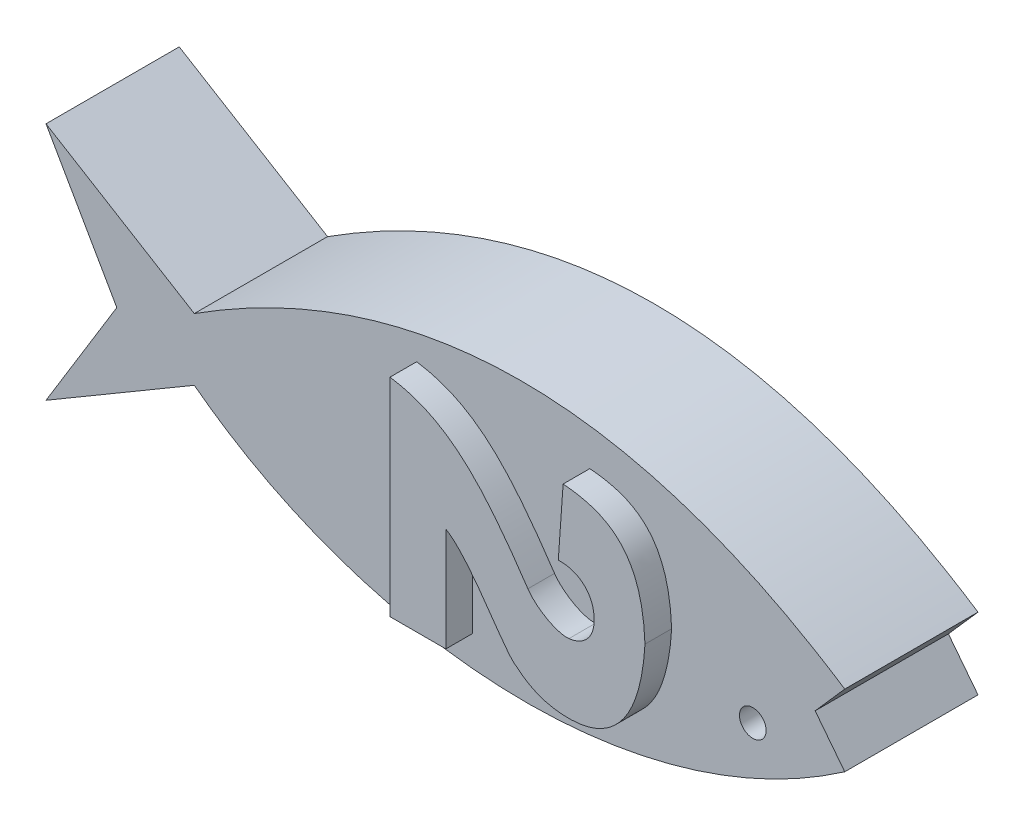
ISO-10303-21;
HEADER;
FILE_DESCRIPTION(('STEP AP214'),'2;1');
FILE_NAME('part.step','',(''),(''),'','','');
FILE_SCHEMA(('AUTOMOTIVE_DESIGN { 1 0 10303 214 1 1 1 1 }'));
ENDSEC;
DATA;
#1=APPLICATION_CONTEXT('core data for automotive mechanical design processes');
#2=APPLICATION_PROTOCOL_DEFINITION('international standard','automotive_design',2000,#1);
#3=PRODUCT_CONTEXT('',#1,'mechanical');
#4=PRODUCT('Part','Part','',(#3));
#5=PRODUCT_RELATED_PRODUCT_CATEGORY('part','',(#4));
#6=PRODUCT_DEFINITION_FORMATION('','',#4);
#7=PRODUCT_DEFINITION_CONTEXT('part definition',#1,'design');
#8=PRODUCT_DEFINITION('design','',#6,#7);
#9=PRODUCT_DEFINITION_SHAPE('','',#8);
#10=(LENGTH_UNIT() NAMED_UNIT(*) SI_UNIT(.MILLI.,.METRE.));
#11=(NAMED_UNIT(*) PLANE_ANGLE_UNIT() SI_UNIT($,.RADIAN.));
#12=(NAMED_UNIT(*) SI_UNIT($,.STERADIAN.) SOLID_ANGLE_UNIT());
#13=UNCERTAINTY_MEASURE_WITH_UNIT(LENGTH_MEASURE(1.E-05),#10,'distance_accuracy_value','');
#14=(GEOMETRIC_REPRESENTATION_CONTEXT(3) GLOBAL_UNCERTAINTY_ASSIGNED_CONTEXT((#13)) GLOBAL_UNIT_ASSIGNED_CONTEXT((#10,
#11,#12)) REPRESENTATION_CONTEXT('',''));
#15=CARTESIAN_POINT('',(0.,0.,0.));
#16=DIRECTION('',(0.,0.,1.));
#17=DIRECTION('',(1.,0.,0.));
#18=AXIS2_PLACEMENT_3D('',#15,#16,#17);
#19=CARTESIAN_POINT('',(17.259438939303,-10.3520637776499,5.));
#20=DIRECTION('',(0.,0.,-1.));
#21=DIRECTION('',(-1.,0.,0.));
#22=AXIS2_PLACEMENT_3D('',#19,#20,#21);
#23=PLANE('',#22);
#24=CARTESIAN_POINT('',(29.9729583496422,-6.64273710384665,5.));
#25=CARTESIAN_POINT('',(22.1417553800262,-12.0787378702692,5.));
#26=CARTESIAN_POINT('',(12.037313537676,-11.2172776076084,5.));
#27=CARTESIAN_POINT('',(5.56534641167516,-6.28572668371996,5.));
#28=B_SPLINE_CURVE_WITH_KNOTS('',3,(#24,#25,#26,#27),.UNSPECIFIED.,.F.,.F.,(4,4),(0.,1.),.UNSPECIFIED.);
#29=CARTESIAN_POINT('',(29.9729583496422,-6.64273710384666,5.));
#30=VERTEX_POINT('',#29);
#31=CARTESIAN_POINT('',(5.56534641167516,-6.28572668371996,5.));
#32=VERTEX_POINT('',#31);
#33=EDGE_CURVE('E204',#30,#32,#28,.T.);
#34=ORIENTED_EDGE('',*,*,#33,.F.);
#35=DIRECTION('',(0.614154388439045,-0.789185901521982,0.));
#36=VECTOR('',#35,1.);
#37=CARTESIAN_POINT('',(29.9729583496422,-6.64273710384666,5.));
#38=LINE('',#37,#36);
#39=CARTESIAN_POINT('',(28.8624377925117,-5.21572268607917,5.));
#40=VERTEX_POINT('',#39);
#41=EDGE_CURVE('E309',#40,#30,#38,.T.);
#42=ORIENTED_EDGE('',*,*,#41,.F.);
#43=DIRECTION('',(-0.660642607187039,-0.750700569847333,0.));
#44=VECTOR('',#43,1.);
#45=CARTESIAN_POINT('',(28.8624377925117,-5.21572268607917,5.));
#46=LINE('',#45,#44);
#47=CARTESIAN_POINT('',(29.9729583496422,-3.95381737449974,5.));
#48=VERTEX_POINT('',#47);
#49=EDGE_CURVE('E232',#48,#40,#46,.T.);
#50=ORIENTED_EDGE('',*,*,#49,.F.);
#51=CARTESIAN_POINT('',(5.56534641167516,-3.95381737449974,5.));
#52=CARTESIAN_POINT('',(17.9190768037639,3.93971731756191,5.));
#53=CARTESIAN_POINT('',(29.9729583496422,-3.95381737449974,5.));
#54=B_SPLINE_CURVE_WITH_KNOTS('',2,(#51,#52,#53),.UNSPECIFIED.,.F.,.F.,(3,3),(0.,1.),.UNSPECIFIED.);
#55=CARTESIAN_POINT('',(5.56534641167516,-3.95381737449974,5.));
#56=VERTEX_POINT('',#55);
#57=EDGE_CURVE('E226',#56,#48,#54,.T.);
#58=ORIENTED_EDGE('',*,*,#57,.F.);
#59=DIRECTION('',(0.854463584925546,-0.519511291538677,0.));
#60=VECTOR('',#59,1.);
#61=CARTESIAN_POINT('',(0.,-0.57010348288733,5.));
#62=LINE('',#61,#60);
#63=CARTESIAN_POINT('',(0.,-0.57010348288733,5.));
#64=VERTEX_POINT('',#63);
#65=EDGE_CURVE('E223',#64,#56,#62,.T.);
#66=ORIENTED_EDGE('',*,*,#65,.F.);
#67=DIRECTION('',(-0.496395302563674,0.868096598076918,0.));
#68=VECTOR('',#67,1.);
#69=CARTESIAN_POINT('',(2.65645960953265,-5.21572268607917,5.));
#70=LINE('',#69,#68);
#71=CARTESIAN_POINT('',(2.65645960953265,-5.21572268607917,5.));
#72=VERTEX_POINT('',#71);
#73=EDGE_CURVE('E220',#72,#64,#70,.T.);
#74=ORIENTED_EDGE('',*,*,#73,.F.);
#75=DIRECTION('',(0.522020846211848,0.852932726608767,0.));
#76=VECTOR('',#75,1.);
#77=CARTESIAN_POINT('',(0.,-9.55612662650962,5.));
#78=LINE('',#77,#76);
#79=CARTESIAN_POINT('',(0.,-9.55612662650962,5.));
#80=VERTEX_POINT('',#79);
#81=EDGE_CURVE('E217',#80,#72,#78,.T.);
#82=ORIENTED_EDGE('',*,*,#81,.F.);
#83=DIRECTION('',(-0.862159793400117,-0.506636448199563,0.));
#84=VECTOR('',#83,1.);
#85=CARTESIAN_POINT('',(5.56534641167516,-6.28572668371996,5.));
#86=LINE('',#85,#84);
#87=EDGE_CURVE('E210',#32,#80,#86,.T.);
#88=ORIENTED_EDGE('',*,*,#87,.F.);
#89=EDGE_LOOP('',(#34,#42,#50,#58,#66,#74,#82,#88));
#90=FACE_BOUND('',#89,.T.);
#91=CARTESIAN_POINT('',(26.5225963003921,-6.78066616591444,5.));
#92=DIRECTION('',(0.,0.,-1.));
#93=DIRECTION('',(-1.,0.,0.));
#94=AXIS2_PLACEMENT_3D('',#91,#92,#93);
#95=CIRCLE('',#94,0.500109692947174);
#96=CARTESIAN_POINT('',(26.0224866074449,-6.78066616591444,5.));
#97=VERTEX_POINT('',#96);
#98=EDGE_CURVE('E196',#97,#97,#95,.T.);
#99=ORIENTED_EDGE('',*,*,#98,.T.);
#100=EDGE_LOOP('',(#99));
#101=FACE_BOUND('',#100,.T.);
#102=CARTESIAN_POINT('',(19.0825608950754,-5.63934124906223,5.));
#103=CARTESIAN_POINT('',(17.4378767824114,-3.20471995006712,5.));
#104=CARTESIAN_POINT('',(16.1255534367257,-1.67091653548521,5.));
#105=CARTESIAN_POINT('',(13.9083053342404,-1.34956401969995,5.));
#106=B_SPLINE_CURVE_WITH_KNOTS('',3,(#102,#103,#104,#105),.UNSPECIFIED.,.F.,.F.,(4,4),(0.,1.),.UNSPECIFIED.);
#107=CARTESIAN_POINT('',(19.0825608950754,-5.63934124906223,5.));
#108=VERTEX_POINT('',#107);
#109=CARTESIAN_POINT('',(13.9083053342404,-1.34956401969995,5.));
#110=VERTEX_POINT('',#109);
#111=EDGE_CURVE('E192',#108,#110,#106,.T.);
#112=ORIENTED_EDGE('',*,*,#111,.F.);
#113=CARTESIAN_POINT('',(20.6238828439911,-6.48748857334275,5.));
#114=CARTESIAN_POINT('',(20.2101931840299,-6.5445847229111,5.));
#115=CARTESIAN_POINT('',(19.4098510301083,-6.12593459302331,5.));
#116=CARTESIAN_POINT('',(19.0825608950754,-5.63934124906223,5.));
#117=B_SPLINE_CURVE_WITH_KNOTS('',3,(#113,#114,#115,#116),.UNSPECIFIED.,.F.,.F.,(4,4),(0.,1.),.UNSPECIFIED.);
#118=CARTESIAN_POINT('',(20.6238828439911,-6.48748857334275,5.));
#119=VERTEX_POINT('',#118);
#120=EDGE_CURVE('E189',#119,#108,#117,.T.);
#121=ORIENTED_EDGE('',*,*,#120,.F.);
#122=CARTESIAN_POINT('',(21.5695602903217,-5.43144256363508,5.));
#123=CARTESIAN_POINT('',(21.5578487234398,-6.102593617884,5.));
#124=CARTESIAN_POINT('',(21.0935036805256,-6.43515902342427,5.));
#125=CARTESIAN_POINT('',(20.6238828439911,-6.48748857334275,5.));
#126=B_SPLINE_CURVE_WITH_KNOTS('',3,(#122,#123,#124,#125),.UNSPECIFIED.,.F.,.F.,(4,4),(0.,1.),.UNSPECIFIED.);
#127=CARTESIAN_POINT('',(21.5695602903217,-5.43144256363508,5.));
#128=VERTEX_POINT('',#127);
#129=EDGE_CURVE('E578',#128,#119,#126,.T.);
#130=ORIENTED_EDGE('',*,*,#129,.F.);
#131=CARTESIAN_POINT('',(20.2233194358235,-4.14083296285347,5.));
#132=CARTESIAN_POINT('',(20.8433595897719,-4.09612471432961,5.));
#133=CARTESIAN_POINT('',(21.5828447940639,-4.48485044834034,5.));
#134=CARTESIAN_POINT('',(21.5695602903217,-5.43144256363508,5.));
#135=B_SPLINE_CURVE_WITH_KNOTS('',3,(#131,#132,#133,#134),.UNSPECIFIED.,.F.,.F.,(4,4),(0.,1.),.UNSPECIFIED.);
#136=CARTESIAN_POINT('',(20.2233194358235,-4.14083296285347,5.));
#137=VERTEX_POINT('',#136);
#138=EDGE_CURVE('E573',#137,#128,#135,.T.);
#139=ORIENTED_EDGE('',*,*,#138,.F.);
#140=DIRECTION('',(-0.0704460164719734,-0.997515593243149,0.));
#141=VECTOR('',#140,1.);
#142=CARTESIAN_POINT('',(20.4044963276472,-1.57536817462962,5.));
#143=LINE('',#142,#141);
#144=CARTESIAN_POINT('',(20.4044963276472,-1.57536817462962,5.));
#145=VERTEX_POINT('',#144);
#146=EDGE_CURVE('E567',#145,#137,#143,.T.);
#147=ORIENTED_EDGE('',*,*,#146,.F.);
#148=CARTESIAN_POINT('',(23.4764886938752,-5.24176877257535,5.));
#149=CARTESIAN_POINT('',(23.3817110794889,-2.66912801857253,5.));
#150=CARTESIAN_POINT('',(22.3343392129162,-1.71536756994435,5.));
#151=CARTESIAN_POINT('',(20.4044963276472,-1.57536817462962,5.));
#152=B_SPLINE_CURVE_WITH_KNOTS('',3,(#148,#149,#150,#151),.UNSPECIFIED.,.F.,.F.,(4,4),(0.,1.),.UNSPECIFIED.);
#153=CARTESIAN_POINT('',(23.4764886938752,-5.24176877257535,5.));
#154=VERTEX_POINT('',#153);
#155=EDGE_CURVE('E559',#154,#145,#152,.T.);
#156=ORIENTED_EDGE('',*,*,#155,.F.);
#157=CARTESIAN_POINT('',(20.6983474092584,-9.08488377695719,5.));
#158=CARTESIAN_POINT('',(22.3502607406454,-9.04007243384816,5.));
#159=CARTESIAN_POINT('',(23.3307946902548,-7.76277459511019,5.));
#160=CARTESIAN_POINT('',(23.4764886938752,-5.24176877257535,5.));
#161=B_SPLINE_CURVE_WITH_KNOTS('',3,(#157,#158,#159,#160),.UNSPECIFIED.,.F.,.F.,(4,4),(0.,1.),.UNSPECIFIED.);
#162=CARTESIAN_POINT('',(20.6983474092584,-9.08488377695719,5.));
#163=VERTEX_POINT('',#162);
#164=EDGE_CURVE('E551',#163,#154,#161,.T.);
#165=ORIENTED_EDGE('',*,*,#164,.F.);
#166=CARTESIAN_POINT('',(18.647004572149,-8.3687854044437,5.));
#167=CARTESIAN_POINT('',(19.1822780952611,-8.85665430914533,5.));
#168=CARTESIAN_POINT('',(19.8661737622276,-9.102220727937,5.));
#169=CARTESIAN_POINT('',(20.6983474092584,-9.08488377695719,5.));
#170=B_SPLINE_CURVE_WITH_KNOTS('',3,(#166,#167,#168,#169),.UNSPECIFIED.,.F.,.F.,(4,4),(0.,1.),.UNSPECIFIED.);
#171=CARTESIAN_POINT('',(18.647004572149,-8.3687854044437,5.));
#172=VERTEX_POINT('',#171);
#173=EDGE_CURVE('E543',#172,#163,#170,.T.);
#174=ORIENTED_EDGE('',*,*,#173,.F.);
#175=CARTESIAN_POINT('',(16.0046214447084,-5.24176877257535,5.));
#176=CARTESIAN_POINT('',(16.9541827763222,-5.78544835930202,5.));
#177=CARTESIAN_POINT('',(18.2214924998813,-8.17239521724326,5.));
#178=CARTESIAN_POINT('',(18.647004572149,-8.3687854044437,5.));
#179=B_SPLINE_CURVE_WITH_KNOTS('',3,(#175,#176,#177,#178),.UNSPECIFIED.,.F.,.F.,(4,4),(0.,1.),.UNSPECIFIED.);
#180=CARTESIAN_POINT('',(16.0046214447084,-5.24176877257535,5.));
#181=VERTEX_POINT('',#180);
#182=EDGE_CURVE('E538',#181,#172,#179,.T.);
#183=ORIENTED_EDGE('',*,*,#182,.F.);
#184=DIRECTION('',(0.,1.,0.));
#185=VECTOR('',#184,1.);
#186=CARTESIAN_POINT('',(16.0046214447084,-9.13397352545076,5.));
#187=LINE('',#186,#185);
#188=CARTESIAN_POINT('',(16.0046214447084,-9.13397352545076,5.));
#189=VERTEX_POINT('',#188);
#190=EDGE_CURVE('E535',#189,#181,#187,.T.);
#191=ORIENTED_EDGE('',*,*,#190,.F.);
#192=DIRECTION('',(1.,0.,0.));
#193=VECTOR('',#192,1.);
#194=CARTESIAN_POINT('',(13.9083053342404,-9.13397352545076,5.));
#195=LINE('',#194,#193);
#196=CARTESIAN_POINT('',(13.9083053342404,-9.13397352545076,5.));
#197=VERTEX_POINT('',#196);
#198=EDGE_CURVE('E56',#197,#189,#195,.T.);
#199=ORIENTED_EDGE('',*,*,#198,.F.);
#200=DIRECTION('',(0.,-1.,0.));
#201=VECTOR('',#200,1.);
#202=CARTESIAN_POINT('',(13.9083053342404,-1.34956401969995,5.));
#203=LINE('',#202,#201);
#204=EDGE_CURVE('E51',#110,#197,#203,.T.);
#205=ORIENTED_EDGE('',*,*,#204,.F.);
#206=EDGE_LOOP('',(#112,#121,#130,#139,#147,#156,#165,#174,#183,#191,#199,#205));
#207=FACE_BOUND('',#206,.T.);
#208=ADVANCED_FACE('F33',(#90,#101,#207),#23,.F.);
#209=DIRECTION('',(0.,0.,-1.));
#210=VECTOR('',#209,1.);
#211=SURFACE_OF_LINEAR_EXTRUSION('',#28,#210);
#212=CARTESIAN_POINT('',(29.9729583496422,-6.64273710384665,0.));
#213=CARTESIAN_POINT('',(22.1417553800262,-12.0787378702692,0.));
#214=CARTESIAN_POINT('',(12.037313537676,-11.2172776076084,0.));
#215=CARTESIAN_POINT('',(5.56534641167516,-6.28572668371996,0.));
#216=B_SPLINE_CURVE_WITH_KNOTS('',3,(#212,#213,#214,#215),.UNSPECIFIED.,.F.,.F.,(4,4),(0.,1.),.UNSPECIFIED.);
#217=CARTESIAN_POINT('',(29.9729583496422,-6.64273710384666,0.));
#218=VERTEX_POINT('',#217);
#219=CARTESIAN_POINT('',(5.56534641167516,-6.28572668371996,0.));
#220=VERTEX_POINT('',#219);
#221=EDGE_CURVE('E203',#218,#220,#216,.T.);
#222=ORIENTED_EDGE('',*,*,#221,.F.);
#223=DIRECTION('',(0.,0.,-1.));
#224=VECTOR('',#223,1.);
#225=CARTESIAN_POINT('',(29.9729583496422,-6.64273710384666,5.));
#226=LINE('',#225,#224);
#227=EDGE_CURVE('E11',#30,#218,#226,.T.);
#228=ORIENTED_EDGE('',*,*,#227,.F.);
#229=ORIENTED_EDGE('',*,*,#33,.T.);
#230=DIRECTION('',(0.,0.,-1.));
#231=VECTOR('',#230,1.);
#232=CARTESIAN_POINT('',(5.56534641167516,-6.28572668371996,5.));
#233=LINE('',#232,#231);
#234=EDGE_CURVE('E38',#32,#220,#233,.T.);
#235=ORIENTED_EDGE('',*,*,#234,.T.);
#236=EDGE_LOOP('',(#222,#228,#229,#235));
#237=FACE_BOUND('',#236,.T.);
#238=ADVANCED_FACE('F35',(#237),#211,.T.);
#239=CARTESIAN_POINT('',(29.9729583496422,-6.64273710384666,5.));
#240=DIRECTION('',(0.789185901521982,0.614154388439045,0.));
#241=DIRECTION('',(-0.614154388439045,0.789185901521982,0.));
#242=AXIS2_PLACEMENT_3D('',#239,#240,#241);
#243=PLANE('',#242);
#244=DIRECTION('',(0.614154388439045,-0.789185901521982,0.));
#245=VECTOR('',#244,1.);
#246=CARTESIAN_POINT('',(29.9729583496422,-6.64273710384666,0.));
#247=LINE('',#246,#245);
#248=CARTESIAN_POINT('',(28.8624377925117,-5.21572268607917,0.));
#249=VERTEX_POINT('',#248);
#250=EDGE_CURVE('E211',#249,#218,#247,.T.);
#251=ORIENTED_EDGE('',*,*,#250,.F.);
#252=DIRECTION('',(0.,0.,-1.));
#253=VECTOR('',#252,1.);
#254=CARTESIAN_POINT('',(28.8624377925117,-5.21572268607917,5.));
#255=LINE('',#254,#253);
#256=EDGE_CURVE('E43',#40,#249,#255,.T.);
#257=ORIENTED_EDGE('',*,*,#256,.F.);
#258=ORIENTED_EDGE('',*,*,#41,.T.);
#259=ORIENTED_EDGE('',*,*,#227,.T.);
#260=EDGE_LOOP('',(#251,#257,#258,#259));
#261=FACE_BOUND('',#260,.T.);
#262=ADVANCED_FACE('F273',(#261),#243,.T.);
#263=CARTESIAN_POINT('',(28.8624377925117,-5.21572268607917,5.));
#264=DIRECTION('',(0.750700569847333,-0.660642607187039,0.));
#265=DIRECTION('',(0.660642607187039,0.750700569847334,0.));
#266=AXIS2_PLACEMENT_3D('',#263,#264,#265);
#267=PLANE('',#266);
#268=DIRECTION('',(-0.660642607187039,-0.750700569847333,0.));
#269=VECTOR('',#268,1.);
#270=CARTESIAN_POINT('',(28.8624377925117,-5.21572268607917,0.));
#271=LINE('',#270,#269);
#272=CARTESIAN_POINT('',(29.9729583496422,-3.95381737449974,0.));
#273=VERTEX_POINT('',#272);
#274=EDGE_CURVE('E293',#273,#249,#271,.T.);
#275=ORIENTED_EDGE('',*,*,#274,.F.);
#276=DIRECTION('',(0.,0.,-1.));
#277=VECTOR('',#276,1.);
#278=CARTESIAN_POINT('',(29.9729583496422,-3.95381737449974,5.));
#279=LINE('',#278,#277);
#280=EDGE_CURVE('E300',#48,#273,#279,.T.);
#281=ORIENTED_EDGE('',*,*,#280,.F.);
#282=ORIENTED_EDGE('',*,*,#49,.T.);
#283=ORIENTED_EDGE('',*,*,#256,.T.);
#284=EDGE_LOOP('',(#275,#281,#282,#283));
#285=FACE_BOUND('',#284,.T.);
#286=ADVANCED_FACE('F243',(#285),#267,.T.);
#287=DIRECTION('',(0.,0.,-1.));
#288=VECTOR('',#287,1.);
#289=SURFACE_OF_LINEAR_EXTRUSION('',#54,#288);
#290=CARTESIAN_POINT('',(5.56534641167516,-3.95381737449974,0.));
#291=CARTESIAN_POINT('',(17.9190768037639,3.93971731756191,0.));
#292=CARTESIAN_POINT('',(29.9729583496422,-3.95381737449974,0.));
#293=B_SPLINE_CURVE_WITH_KNOTS('',2,(#290,#291,#292),.UNSPECIFIED.,.F.,.F.,(3,3),(0.,1.),.UNSPECIFIED.);
#294=CARTESIAN_POINT('',(5.56534641167516,-3.95381737449974,0.));
#295=VERTEX_POINT('',#294);
#296=EDGE_CURVE('E295',#295,#273,#293,.T.);
#297=ORIENTED_EDGE('',*,*,#296,.F.);
#298=DIRECTION('',(0.,0.,-1.));
#299=VECTOR('',#298,1.);
#300=CARTESIAN_POINT('',(5.56534641167516,-3.95381737449974,5.));
#301=LINE('',#300,#299);
#302=EDGE_CURVE('E302',#56,#295,#301,.T.);
#303=ORIENTED_EDGE('',*,*,#302,.F.);
#304=ORIENTED_EDGE('',*,*,#57,.T.);
#305=ORIENTED_EDGE('',*,*,#280,.T.);
#306=EDGE_LOOP('',(#297,#303,#304,#305));
#307=FACE_BOUND('',#306,.T.);
#308=ADVANCED_FACE('F238',(#307),#289,.T.);
#309=CARTESIAN_POINT('',(0.,-0.57010348288733,5.));
#310=DIRECTION('',(0.519511291538677,0.854463584925546,0.));
#311=DIRECTION('',(-0.854463584925546,0.519511291538677,0.));
#312=AXIS2_PLACEMENT_3D('',#309,#310,#311);
#313=PLANE('',#312);
#314=DIRECTION('',(0.854463584925546,-0.519511291538677,0.));
#315=VECTOR('',#314,1.);
#316=CARTESIAN_POINT('',(0.,-0.57010348288733,0.));
#317=LINE('',#316,#315);
#318=CARTESIAN_POINT('',(0.,-0.57010348288733,0.));
#319=VERTEX_POINT('',#318);
#320=EDGE_CURVE('E327',#319,#295,#317,.T.);
#321=ORIENTED_EDGE('',*,*,#320,.F.);
#322=DIRECTION('',(0.,0.,-1.));
#323=VECTOR('',#322,1.);
#324=CARTESIAN_POINT('',(0.,-0.57010348288733,5.));
#325=LINE('',#324,#323);
#326=EDGE_CURVE('E304',#64,#319,#325,.T.);
#327=ORIENTED_EDGE('',*,*,#326,.F.);
#328=ORIENTED_EDGE('',*,*,#65,.T.);
#329=ORIENTED_EDGE('',*,*,#302,.T.);
#330=EDGE_LOOP('',(#321,#327,#328,#329));
#331=FACE_BOUND('',#330,.T.);
#332=ADVANCED_FACE('F242',(#331),#313,.T.);
#333=CARTESIAN_POINT('',(2.65645960953265,-5.21572268607917,5.));
#334=DIRECTION('',(-0.868096598076918,-0.496395302563674,0.));
#335=DIRECTION('',(0.496395302563674,-0.868096598076918,0.));
#336=AXIS2_PLACEMENT_3D('',#333,#334,#335);
#337=PLANE('',#336);
#338=DIRECTION('',(-0.496395302563674,0.868096598076918,0.));
#339=VECTOR('',#338,1.);
#340=CARTESIAN_POINT('',(2.65645960953265,-5.21572268607917,0.));
#341=LINE('',#340,#339);
#342=CARTESIAN_POINT('',(2.65645960953265,-5.21572268607917,0.));
#343=VERTEX_POINT('',#342);
#344=EDGE_CURVE('E324',#343,#319,#341,.T.);
#345=ORIENTED_EDGE('',*,*,#344,.F.);
#346=DIRECTION('',(0.,0.,-1.));
#347=VECTOR('',#346,1.);
#348=CARTESIAN_POINT('',(2.65645960953265,-5.21572268607917,5.));
#349=LINE('',#348,#347);
#350=EDGE_CURVE('E306',#72,#343,#349,.T.);
#351=ORIENTED_EDGE('',*,*,#350,.F.);
#352=ORIENTED_EDGE('',*,*,#73,.T.);
#353=ORIENTED_EDGE('',*,*,#326,.T.);
#354=EDGE_LOOP('',(#345,#351,#352,#353));
#355=FACE_BOUND('',#354,.T.);
#356=ADVANCED_FACE('F248',(#355),#337,.T.);
#357=CARTESIAN_POINT('',(0.,-9.55612662650962,5.));
#358=DIRECTION('',(-0.852932726608767,0.522020846211848,0.));
#359=DIRECTION('',(-0.522020846211848,-0.852932726608767,0.));
#360=AXIS2_PLACEMENT_3D('',#357,#358,#359);
#361=PLANE('',#360);
#362=DIRECTION('',(0.522020846211848,0.852932726608767,0.));
#363=VECTOR('',#362,1.);
#364=CARTESIAN_POINT('',(0.,-9.55612662650962,0.));
#365=LINE('',#364,#363);
#366=CARTESIAN_POINT('',(0.,-9.55612662650962,0.));
#367=VERTEX_POINT('',#366);
#368=EDGE_CURVE('E321',#367,#343,#365,.T.);
#369=ORIENTED_EDGE('',*,*,#368,.F.);
#370=DIRECTION('',(0.,0.,-1.));
#371=VECTOR('',#370,1.);
#372=CARTESIAN_POINT('',(0.,-9.55612662650962,5.));
#373=LINE('',#372,#371);
#374=EDGE_CURVE('E307',#80,#367,#373,.T.);
#375=ORIENTED_EDGE('',*,*,#374,.F.);
#376=ORIENTED_EDGE('',*,*,#81,.T.);
#377=ORIENTED_EDGE('',*,*,#350,.T.);
#378=EDGE_LOOP('',(#369,#375,#376,#377));
#379=FACE_BOUND('',#378,.T.);
#380=ADVANCED_FACE('F252',(#379),#361,.T.);
#381=CARTESIAN_POINT('',(5.56534641167516,-6.28572668371996,5.));
#382=DIRECTION('',(0.506636448199563,-0.862159793400117,0.));
#383=DIRECTION('',(0.862159793400117,0.506636448199563,0.));
#384=AXIS2_PLACEMENT_3D('',#381,#382,#383);
#385=PLANE('',#384);
#386=DIRECTION('',(-0.862159793400117,-0.506636448199563,0.));
#387=VECTOR('',#386,1.);
#388=CARTESIAN_POINT('',(5.56534641167516,-6.28572668371996,0.));
#389=LINE('',#388,#387);
#390=EDGE_CURVE('E315',#220,#367,#389,.T.);
#391=ORIENTED_EDGE('',*,*,#390,.F.);
#392=ORIENTED_EDGE('',*,*,#234,.F.);
#393=ORIENTED_EDGE('',*,*,#87,.T.);
#394=ORIENTED_EDGE('',*,*,#374,.T.);
#395=EDGE_LOOP('',(#391,#392,#393,#394));
#396=FACE_BOUND('',#395,.T.);
#397=ADVANCED_FACE('F255',(#396),#385,.T.);
#398=CARTESIAN_POINT('',(17.259438939303,-10.3520637776499,0.));
#399=DIRECTION('',(0.,0.,-1.));
#400=DIRECTION('',(-1.,0.,0.));
#401=AXIS2_PLACEMENT_3D('',#398,#399,#400);
#402=PLANE('',#401);
#403=CARTESIAN_POINT('',(26.5225963003921,-6.78066616591444,0.));
#404=DIRECTION('',(0.,0.,-1.));
#405=DIRECTION('',(-1.,0.,0.));
#406=AXIS2_PLACEMENT_3D('',#403,#404,#405);
#407=CIRCLE('',#406,0.500109692947174);
#408=CARTESIAN_POINT('',(26.0224866074449,-6.78066616591444,0.));
#409=VERTEX_POINT('',#408);
#410=EDGE_CURVE('E193',#409,#409,#407,.T.);
#411=ORIENTED_EDGE('',*,*,#410,.F.);
#412=EDGE_LOOP('',(#411));
#413=FACE_BOUND('',#412,.T.);
#414=ORIENTED_EDGE('',*,*,#221,.T.);
#415=ORIENTED_EDGE('',*,*,#390,.T.);
#416=ORIENTED_EDGE('',*,*,#368,.T.);
#417=ORIENTED_EDGE('',*,*,#344,.T.);
#418=ORIENTED_EDGE('',*,*,#320,.T.);
#419=ORIENTED_EDGE('',*,*,#296,.T.);
#420=ORIENTED_EDGE('',*,*,#274,.T.);
#421=ORIENTED_EDGE('',*,*,#250,.T.);
#422=EDGE_LOOP('',(#414,#415,#416,#417,#418,#419,#420,#421));
#423=FACE_BOUND('',#422,.T.);
#424=ADVANCED_FACE('F258',(#413,#423),#402,.T.);
#425=CARTESIAN_POINT('',(26.5225963003921,-6.78066616591444,5.));
#426=DIRECTION('',(0.,0.,-1.));
#427=DIRECTION('',(-1.,0.,0.));
#428=AXIS2_PLACEMENT_3D('',#425,#426,#427);
#429=CYLINDRICAL_SURFACE('',#428,0.500109692947174);
#430=ORIENTED_EDGE('',*,*,#98,.F.);
#431=EDGE_LOOP('',(#430));
#432=FACE_BOUND('',#431,.T.);
#433=ORIENTED_EDGE('',*,*,#410,.T.);
#434=EDGE_LOOP('',(#433));
#435=FACE_BOUND('',#434,.T.);
#436=ADVANCED_FACE('F263',(#432,#435),#429,.F.);
#437=CARTESIAN_POINT('',(19.0825608950754,-5.63934124906223,6.));
#438=CARTESIAN_POINT('',(17.4378767824114,-3.20471995006712,6.));
#439=CARTESIAN_POINT('',(16.1255534367257,-1.67091653548521,6.));
#440=CARTESIAN_POINT('',(13.9083053342404,-1.34956401969995,6.));
#441=B_SPLINE_CURVE_WITH_KNOTS('',3,(#437,#438,#439,#440),.UNSPECIFIED.,.F.,.F.,(4,4),(0.,1.),.UNSPECIFIED.);
#442=DIRECTION('',(0.,0.,-1.));
#443=VECTOR('',#442,1.);
#444=SURFACE_OF_LINEAR_EXTRUSION('',#441,#443);
#445=ORIENTED_EDGE('',*,*,#111,.T.);
#446=DIRECTION('',(0.,0.,-1.));
#447=VECTOR('',#446,1.);
#448=CARTESIAN_POINT('',(13.9083053342404,-1.34956401969995,6.));
#449=LINE('',#448,#447);
#450=CARTESIAN_POINT('',(13.9083053342404,-1.34956401969995,6.));
#451=VERTEX_POINT('',#450);
#452=EDGE_CURVE('E173',#451,#110,#449,.T.);
#453=ORIENTED_EDGE('',*,*,#452,.F.);
#454=CARTESIAN_POINT('',(19.0825608950754,-5.63934124906223,6.));
#455=VERTEX_POINT('',#454);
#456=EDGE_CURVE('E180',#455,#451,#441,.T.);
#457=ORIENTED_EDGE('',*,*,#456,.F.);
#458=DIRECTION('',(0.,0.,-1.));
#459=VECTOR('',#458,1.);
#460=CARTESIAN_POINT('',(19.0825608950754,-5.63934124906223,6.));
#461=LINE('',#460,#459);
#462=EDGE_CURVE('E518',#455,#108,#461,.T.);
#463=ORIENTED_EDGE('',*,*,#462,.T.);
#464=EDGE_LOOP('',(#445,#453,#457,#463));
#465=FACE_BOUND('',#464,.T.);
#466=ADVANCED_FACE('F191',(#465),#444,.F.);
#467=CARTESIAN_POINT('',(13.9083053342404,-1.34956401969995,6.));
#468=DIRECTION('',(1.,0.,0.));
#469=DIRECTION('',(0.,0.,-1.));
#470=AXIS2_PLACEMENT_3D('',#467,#468,#469);
#471=PLANE('',#470);
#472=ORIENTED_EDGE('',*,*,#204,.T.);
#473=DIRECTION('',(0.,0.,-1.));
#474=VECTOR('',#473,1.);
#475=CARTESIAN_POINT('',(13.9083053342404,-9.13397352545076,6.));
#476=LINE('',#475,#474);
#477=CARTESIAN_POINT('',(13.9083053342404,-9.13397352545076,6.));
#478=VERTEX_POINT('',#477);
#479=EDGE_CURVE('E176',#478,#197,#476,.T.);
#480=ORIENTED_EDGE('',*,*,#479,.F.);
#481=DIRECTION('',(0.,-1.,0.));
#482=VECTOR('',#481,1.);
#483=CARTESIAN_POINT('',(13.9083053342404,-1.34956401969995,6.));
#484=LINE('',#483,#482);
#485=EDGE_CURVE('E169',#451,#478,#484,.T.);
#486=ORIENTED_EDGE('',*,*,#485,.F.);
#487=ORIENTED_EDGE('',*,*,#452,.T.);
#488=EDGE_LOOP('',(#472,#480,#486,#487));
#489=FACE_BOUND('',#488,.T.);
#490=ADVANCED_FACE('F171',(#489),#471,.F.);
#491=CARTESIAN_POINT('',(13.9083053342404,-9.13397352545076,6.));
#492=DIRECTION('',(0.,1.,0.));
#493=DIRECTION('',(0.,0.,1.));
#494=AXIS2_PLACEMENT_3D('',#491,#492,#493);
#495=PLANE('',#494);
#496=ORIENTED_EDGE('',*,*,#198,.T.);
#497=DIRECTION('',(0.,0.,-1.));
#498=VECTOR('',#497,1.);
#499=CARTESIAN_POINT('',(16.0046214447084,-9.13397352545076,6.));
#500=LINE('',#499,#498);
#501=CARTESIAN_POINT('',(16.0046214447084,-9.13397352545076,6.));
#502=VERTEX_POINT('',#501);
#503=EDGE_CURVE('E198',#502,#189,#500,.T.);
#504=ORIENTED_EDGE('',*,*,#503,.F.);
#505=DIRECTION('',(1.,0.,0.));
#506=VECTOR('',#505,1.);
#507=CARTESIAN_POINT('',(13.9083053342404,-9.13397352545076,6.));
#508=LINE('',#507,#506);
#509=EDGE_CURVE('E179',#478,#502,#508,.T.);
#510=ORIENTED_EDGE('',*,*,#509,.F.);
#511=ORIENTED_EDGE('',*,*,#479,.T.);
#512=EDGE_LOOP('',(#496,#504,#510,#511));
#513=FACE_BOUND('',#512,.T.);
#514=ADVANCED_FACE('F401',(#513),#495,.F.);
#515=CARTESIAN_POINT('',(16.0046214447084,-9.13397352545076,6.));
#516=DIRECTION('',(-1.,0.,0.));
#517=DIRECTION('',(0.,0.,1.));
#518=AXIS2_PLACEMENT_3D('',#515,#516,#517);
#519=PLANE('',#518);
#520=ORIENTED_EDGE('',*,*,#190,.T.);
#521=DIRECTION('',(0.,0.,-1.));
#522=VECTOR('',#521,1.);
#523=CARTESIAN_POINT('',(16.0046214447084,-5.24176877257535,6.));
#524=LINE('',#523,#522);
#525=CARTESIAN_POINT('',(16.0046214447084,-5.24176877257535,6.));
#526=VERTEX_POINT('',#525);
#527=EDGE_CURVE('E618',#526,#181,#524,.T.);
#528=ORIENTED_EDGE('',*,*,#527,.F.);
#529=DIRECTION('',(0.,1.,0.));
#530=VECTOR('',#529,1.);
#531=CARTESIAN_POINT('',(16.0046214447084,-9.13397352545076,6.));
#532=LINE('',#531,#530);
#533=EDGE_CURVE('E624',#502,#526,#532,.T.);
#534=ORIENTED_EDGE('',*,*,#533,.F.);
#535=ORIENTED_EDGE('',*,*,#503,.T.);
#536=EDGE_LOOP('',(#520,#528,#534,#535));
#537=FACE_BOUND('',#536,.T.);
#538=ADVANCED_FACE('F410',(#537),#519,.F.);
#539=CARTESIAN_POINT('',(16.0046214447084,-5.24176877257535,6.));
#540=CARTESIAN_POINT('',(16.9541827763222,-5.78544835930202,6.));
#541=CARTESIAN_POINT('',(18.2214924998813,-8.17239521724326,6.));
#542=CARTESIAN_POINT('',(18.647004572149,-8.3687854044437,6.));
#543=B_SPLINE_CURVE_WITH_KNOTS('',3,(#539,#540,#541,#542),.UNSPECIFIED.,.F.,.F.,(4,4),(0.,1.),.UNSPECIFIED.);
#544=DIRECTION('',(0.,0.,-1.));
#545=VECTOR('',#544,1.);
#546=SURFACE_OF_LINEAR_EXTRUSION('',#543,#545);
#547=ORIENTED_EDGE('',*,*,#182,.T.);
#548=DIRECTION('',(0.,0.,-1.));
#549=VECTOR('',#548,1.);
#550=CARTESIAN_POINT('',(18.647004572149,-8.3687854044437,6.));
#551=LINE('',#550,#549);
#552=CARTESIAN_POINT('',(18.647004572149,-8.3687854044437,6.));
#553=VERTEX_POINT('',#552);
#554=EDGE_CURVE('E615',#553,#172,#551,.T.);
#555=ORIENTED_EDGE('',*,*,#554,.F.);
#556=EDGE_CURVE('E626',#526,#553,#543,.T.);
#557=ORIENTED_EDGE('',*,*,#556,.F.);
#558=ORIENTED_EDGE('',*,*,#527,.T.);
#559=EDGE_LOOP('',(#547,#555,#557,#558));
#560=FACE_BOUND('',#559,.T.);
#561=ADVANCED_FACE('F420',(#560),#546,.F.);
#562=CARTESIAN_POINT('',(18.647004572149,-8.3687854044437,6.));
#563=CARTESIAN_POINT('',(19.1822780952611,-8.85665430914533,6.));
#564=CARTESIAN_POINT('',(19.8661737622276,-9.102220727937,6.));
#565=CARTESIAN_POINT('',(20.6983474092584,-9.08488377695719,6.));
#566=B_SPLINE_CURVE_WITH_KNOTS('',3,(#562,#563,#564,#565),.UNSPECIFIED.,.F.,.F.,(4,4),(0.,1.),.UNSPECIFIED.);
#567=DIRECTION('',(0.,0.,-1.));
#568=VECTOR('',#567,1.);
#569=SURFACE_OF_LINEAR_EXTRUSION('',#566,#568);
#570=ORIENTED_EDGE('',*,*,#173,.T.);
#571=DIRECTION('',(0.,0.,-1.));
#572=VECTOR('',#571,1.);
#573=CARTESIAN_POINT('',(20.6983474092584,-9.08488377695719,6.));
#574=LINE('',#573,#572);
#575=CARTESIAN_POINT('',(20.6983474092584,-9.08488377695719,6.));
#576=VERTEX_POINT('',#575);
#577=EDGE_CURVE('E612',#576,#163,#574,.T.);
#578=ORIENTED_EDGE('',*,*,#577,.F.);
#579=EDGE_CURVE('E633',#553,#576,#566,.T.);
#580=ORIENTED_EDGE('',*,*,#579,.F.);
#581=ORIENTED_EDGE('',*,*,#554,.T.);
#582=EDGE_LOOP('',(#570,#578,#580,#581));
#583=FACE_BOUND('',#582,.T.);
#584=ADVANCED_FACE('F430',(#583),#569,.F.);
#585=CARTESIAN_POINT('',(20.6983474092584,-9.08488377695719,6.));
#586=CARTESIAN_POINT('',(22.3502607406454,-9.04007243384816,6.));
#587=CARTESIAN_POINT('',(23.3307946902548,-7.76277459511019,6.));
#588=CARTESIAN_POINT('',(23.4764886938752,-5.24176877257535,6.));
#589=B_SPLINE_CURVE_WITH_KNOTS('',3,(#585,#586,#587,#588),.UNSPECIFIED.,.F.,.F.,(4,4),(0.,1.),.UNSPECIFIED.);
#590=DIRECTION('',(0.,0.,-1.));
#591=VECTOR('',#590,1.);
#592=SURFACE_OF_LINEAR_EXTRUSION('',#589,#591);
#593=ORIENTED_EDGE('',*,*,#164,.T.);
#594=DIRECTION('',(0.,0.,-1.));
#595=VECTOR('',#594,1.);
#596=CARTESIAN_POINT('',(23.4764886938752,-5.24176877257535,6.));
#597=LINE('',#596,#595);
#598=CARTESIAN_POINT('',(23.4764886938752,-5.24176877257535,6.));
#599=VERTEX_POINT('',#598);
#600=EDGE_CURVE('E609',#599,#154,#597,.T.);
#601=ORIENTED_EDGE('',*,*,#600,.F.);
#602=EDGE_CURVE('E648',#576,#599,#589,.T.);
#603=ORIENTED_EDGE('',*,*,#602,.F.);
#604=ORIENTED_EDGE('',*,*,#577,.T.);
#605=EDGE_LOOP('',(#593,#601,#603,#604));
#606=FACE_BOUND('',#605,.T.);
#607=ADVANCED_FACE('F440',(#606),#592,.F.);
#608=CARTESIAN_POINT('',(23.4764886938752,-5.24176877257535,6.));
#609=CARTESIAN_POINT('',(23.3817110794889,-2.66912801857253,6.));
#610=CARTESIAN_POINT('',(22.3343392129162,-1.71536756994435,6.));
#611=CARTESIAN_POINT('',(20.4044963276472,-1.57536817462962,6.));
#612=B_SPLINE_CURVE_WITH_KNOTS('',3,(#608,#609,#610,#611),.UNSPECIFIED.,.F.,.F.,(4,4),(0.,1.),.UNSPECIFIED.);
#613=DIRECTION('',(0.,0.,-1.));
#614=VECTOR('',#613,1.);
#615=SURFACE_OF_LINEAR_EXTRUSION('',#612,#614);
#616=ORIENTED_EDGE('',*,*,#155,.T.);
#617=DIRECTION('',(0.,0.,-1.));
#618=VECTOR('',#617,1.);
#619=CARTESIAN_POINT('',(20.4044963276472,-1.57536817462962,6.));
#620=LINE('',#619,#618);
#621=CARTESIAN_POINT('',(20.4044963276472,-1.57536817462962,6.));
#622=VERTEX_POINT('',#621);
#623=EDGE_CURVE('E606',#622,#145,#620,.T.);
#624=ORIENTED_EDGE('',*,*,#623,.F.);
#625=EDGE_CURVE('E652',#599,#622,#612,.T.);
#626=ORIENTED_EDGE('',*,*,#625,.F.);
#627=ORIENTED_EDGE('',*,*,#600,.T.);
#628=EDGE_LOOP('',(#616,#624,#626,#627));
#629=FACE_BOUND('',#628,.T.);
#630=ADVANCED_FACE('F450',(#629),#615,.F.);
#631=CARTESIAN_POINT('',(20.4044963276472,-1.57536817462962,6.));
#632=DIRECTION('',(0.997515593243148,-0.0704460164719733,0.));
#633=DIRECTION('',(0.0704460164719733,0.997515593243149,0.));
#634=AXIS2_PLACEMENT_3D('',#631,#632,#633);
#635=PLANE('',#634);
#636=ORIENTED_EDGE('',*,*,#146,.T.);
#637=DIRECTION('',(0.,0.,-1.));
#638=VECTOR('',#637,1.);
#639=CARTESIAN_POINT('',(20.2233194358235,-4.14083296285347,6.));
#640=LINE('',#639,#638);
#641=CARTESIAN_POINT('',(20.2233194358235,-4.14083296285347,6.));
#642=VERTEX_POINT('',#641);
#643=EDGE_CURVE('E603',#642,#137,#640,.T.);
#644=ORIENTED_EDGE('',*,*,#643,.F.);
#645=DIRECTION('',(-0.0704460164719734,-0.997515593243149,0.));
#646=VECTOR('',#645,1.);
#647=CARTESIAN_POINT('',(20.4044963276472,-1.57536817462962,6.));
#648=LINE('',#647,#646);
#649=EDGE_CURVE('E660',#622,#642,#648,.T.);
#650=ORIENTED_EDGE('',*,*,#649,.F.);
#651=ORIENTED_EDGE('',*,*,#623,.T.);
#652=EDGE_LOOP('',(#636,#644,#650,#651));
#653=FACE_BOUND('',#652,.T.);
#654=ADVANCED_FACE('F460',(#653),#635,.F.);
#655=CARTESIAN_POINT('',(20.2233194358235,-4.14083296285347,6.));
#656=CARTESIAN_POINT('',(20.8433595897719,-4.09612471432961,6.));
#657=CARTESIAN_POINT('',(21.5828447940639,-4.48485044834034,6.));
#658=CARTESIAN_POINT('',(21.5695602903217,-5.43144256363508,6.));
#659=B_SPLINE_CURVE_WITH_KNOTS('',3,(#655,#656,#657,#658),.UNSPECIFIED.,.F.,.F.,(4,4),(0.,1.),.UNSPECIFIED.);
#660=DIRECTION('',(0.,0.,-1.));
#661=VECTOR('',#660,1.);
#662=SURFACE_OF_LINEAR_EXTRUSION('',#659,#661);
#663=ORIENTED_EDGE('',*,*,#138,.T.);
#664=DIRECTION('',(0.,0.,-1.));
#665=VECTOR('',#664,1.);
#666=CARTESIAN_POINT('',(21.5695602903217,-5.43144256363508,6.));
#667=LINE('',#666,#665);
#668=CARTESIAN_POINT('',(21.5695602903217,-5.43144256363508,6.));
#669=VERTEX_POINT('',#668);
#670=EDGE_CURVE('E600',#669,#128,#667,.T.);
#671=ORIENTED_EDGE('',*,*,#670,.F.);
#672=EDGE_CURVE('E664',#642,#669,#659,.T.);
#673=ORIENTED_EDGE('',*,*,#672,.F.);
#674=ORIENTED_EDGE('',*,*,#643,.T.);
#675=EDGE_LOOP('',(#663,#671,#673,#674));
#676=FACE_BOUND('',#675,.T.);
#677=ADVANCED_FACE('F470',(#676),#662,.F.);
#678=CARTESIAN_POINT('',(21.5695602903217,-5.43144256363508,6.));
#679=CARTESIAN_POINT('',(21.5578487234398,-6.102593617884,6.));
#680=CARTESIAN_POINT('',(21.0935036805256,-6.43515902342427,6.));
#681=CARTESIAN_POINT('',(20.6238828439911,-6.48748857334275,6.));
#682=B_SPLINE_CURVE_WITH_KNOTS('',3,(#678,#679,#680,#681),.UNSPECIFIED.,.F.,.F.,(4,4),(0.,1.),.UNSPECIFIED.);
#683=DIRECTION('',(0.,0.,-1.));
#684=VECTOR('',#683,1.);
#685=SURFACE_OF_LINEAR_EXTRUSION('',#682,#684);
#686=ORIENTED_EDGE('',*,*,#129,.T.);
#687=DIRECTION('',(0.,0.,-1.));
#688=VECTOR('',#687,1.);
#689=CARTESIAN_POINT('',(20.6238828439911,-6.48748857334275,6.));
#690=LINE('',#689,#688);
#691=CARTESIAN_POINT('',(20.6238828439911,-6.48748857334275,6.));
#692=VERTEX_POINT('',#691);
#693=EDGE_CURVE('E597',#692,#119,#690,.T.);
#694=ORIENTED_EDGE('',*,*,#693,.F.);
#695=EDGE_CURVE('E519',#669,#692,#682,.T.);
#696=ORIENTED_EDGE('',*,*,#695,.F.);
#697=ORIENTED_EDGE('',*,*,#670,.T.);
#698=EDGE_LOOP('',(#686,#694,#696,#697));
#699=FACE_BOUND('',#698,.T.);
#700=ADVANCED_FACE('F480',(#699),#685,.F.);
#701=CARTESIAN_POINT('',(20.6238828439911,-6.48748857334275,6.));
#702=CARTESIAN_POINT('',(20.2101931840299,-6.5445847229111,6.));
#703=CARTESIAN_POINT('',(19.4098510301083,-6.12593459302331,6.));
#704=CARTESIAN_POINT('',(19.0825608950754,-5.63934124906223,6.));
#705=B_SPLINE_CURVE_WITH_KNOTS('',3,(#701,#702,#703,#704),.UNSPECIFIED.,.F.,.F.,(4,4),(0.,1.),.UNSPECIFIED.);
#706=DIRECTION('',(0.,0.,-1.));
#707=VECTOR('',#706,1.);
#708=SURFACE_OF_LINEAR_EXTRUSION('',#705,#707);
#709=ORIENTED_EDGE('',*,*,#120,.T.);
#710=ORIENTED_EDGE('',*,*,#462,.F.);
#711=EDGE_CURVE('E185',#692,#455,#705,.T.);
#712=ORIENTED_EDGE('',*,*,#711,.F.);
#713=ORIENTED_EDGE('',*,*,#693,.T.);
#714=EDGE_LOOP('',(#709,#710,#712,#713));
#715=FACE_BOUND('',#714,.T.);
#716=ADVANCED_FACE('F490',(#715),#708,.F.);
#717=CARTESIAN_POINT('',(16.7101446108409,-2.7019768406774,6.));
#718=DIRECTION('',(0.,0.,1.));
#719=DIRECTION('',(1.,0.,0.));
#720=AXIS2_PLACEMENT_3D('',#717,#718,#719);
#721=PLANE('',#720);
#722=ORIENTED_EDGE('',*,*,#456,.T.);
#723=ORIENTED_EDGE('',*,*,#485,.T.);
#724=ORIENTED_EDGE('',*,*,#509,.T.);
#725=ORIENTED_EDGE('',*,*,#533,.T.);
#726=ORIENTED_EDGE('',*,*,#556,.T.);
#727=ORIENTED_EDGE('',*,*,#579,.T.);
#728=ORIENTED_EDGE('',*,*,#602,.T.);
#729=ORIENTED_EDGE('',*,*,#625,.T.);
#730=ORIENTED_EDGE('',*,*,#649,.T.);
#731=ORIENTED_EDGE('',*,*,#672,.T.);
#732=ORIENTED_EDGE('',*,*,#695,.T.);
#733=ORIENTED_EDGE('',*,*,#711,.T.);
#734=EDGE_LOOP('',(#722,#723,#724,#725,#726,#727,#728,#729,#730,#731,#732,#733));
#735=FACE_BOUND('',#734,.T.);
#736=ADVANCED_FACE('F183',(#735),#721,.T.);
#737=CLOSED_SHELL('',(#208,#238,#262,#286,#308,#332,#356,#380,#397,#424,#436,#466,#490,#514,
#538,#561,#584,#607,#630,#654,#677,#700,#716,#736));
#738=MANIFOLD_SOLID_BREP('B2',#737);
#739=ADVANCED_BREP_SHAPE_REPRESENTATION('',(#18,#738),#14);
#740=SHAPE_DEFINITION_REPRESENTATION(#9,#739);
ENDSEC;
END-ISO-10303-21;
